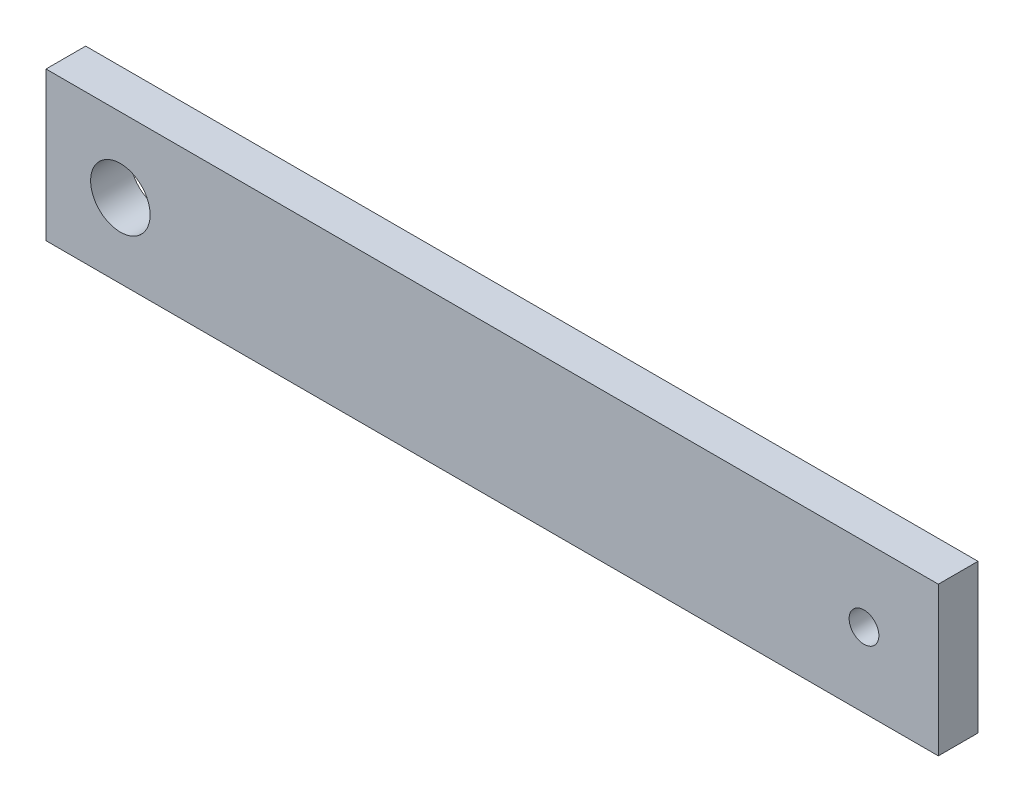
ISO-10303-21;
HEADER;
FILE_DESCRIPTION(('STEP AP214'),'2;1');
FILE_NAME('part.step','',(''),(''),'','','');
FILE_SCHEMA(('AUTOMOTIVE_DESIGN { 1 0 10303 214 1 1 1 1 }'));
ENDSEC;
DATA;
#1=APPLICATION_CONTEXT('core data for automotive mechanical design processes');
#2=APPLICATION_PROTOCOL_DEFINITION('international standard','automotive_design',2000,#1);
#3=PRODUCT_CONTEXT('',#1,'mechanical');
#4=PRODUCT('Part','Part','',(#3));
#5=PRODUCT_RELATED_PRODUCT_CATEGORY('part','',(#4));
#6=PRODUCT_DEFINITION_FORMATION('','',#4);
#7=PRODUCT_DEFINITION_CONTEXT('part definition',#1,'design');
#8=PRODUCT_DEFINITION('design','',#6,#7);
#9=PRODUCT_DEFINITION_SHAPE('','',#8);
#10=(LENGTH_UNIT() NAMED_UNIT(*) SI_UNIT(.MILLI.,.METRE.));
#11=(NAMED_UNIT(*) PLANE_ANGLE_UNIT() SI_UNIT($,.RADIAN.));
#12=(NAMED_UNIT(*) SI_UNIT($,.STERADIAN.) SOLID_ANGLE_UNIT());
#13=UNCERTAINTY_MEASURE_WITH_UNIT(LENGTH_MEASURE(1.E-05),#10,'distance_accuracy_value','');
#14=(GEOMETRIC_REPRESENTATION_CONTEXT(3) GLOBAL_UNCERTAINTY_ASSIGNED_CONTEXT((#13)) GLOBAL_UNIT_ASSIGNED_CONTEXT((#10,
#11,#12)) REPRESENTATION_CONTEXT('',''));
#15=CARTESIAN_POINT('',(0.,0.,0.));
#16=DIRECTION('',(0.,0.,1.));
#17=DIRECTION('',(1.,0.,0.));
#18=AXIS2_PLACEMENT_3D('',#15,#16,#17);
#19=CARTESIAN_POINT('',(0.,0.,8.));
#20=DIRECTION('',(0.,0.,1.));
#21=DIRECTION('',(1.,0.,0.));
#22=AXIS2_PLACEMENT_3D('',#19,#20,#21);
#23=PLANE('',#22);
#24=CARTESIAN_POINT('',(-75.,0.,8.));
#25=DIRECTION('',(0.,0.,1.));
#26=DIRECTION('',(1.,0.,0.));
#27=AXIS2_PLACEMENT_3D('',#24,#25,#26);
#28=CIRCLE('',#27,6.);
#29=CARTESIAN_POINT('',(-69.,0.,8.));
#30=VERTEX_POINT('',#29);
#31=EDGE_CURVE('E103',#30,#30,#28,.T.);
#32=ORIENTED_EDGE('',*,*,#31,.F.);
#33=EDGE_LOOP('',(#32));
#34=FACE_BOUND('',#33,.T.);
#35=DIRECTION('',(0.,1.,0.));
#36=VECTOR('',#35,1.);
#37=CARTESIAN_POINT('',(90.,15.,8.));
#38=LINE('',#37,#36);
#39=CARTESIAN_POINT('',(90.,-15.,8.));
#40=VERTEX_POINT('',#39);
#41=CARTESIAN_POINT('',(90.,15.,8.));
#42=VERTEX_POINT('',#41);
#43=EDGE_CURVE('E88',#40,#42,#38,.T.);
#44=ORIENTED_EDGE('',*,*,#43,.T.);
#45=DIRECTION('',(-1.,0.,0.));
#46=VECTOR('',#45,1.);
#47=CARTESIAN_POINT('',(-90.,15.,8.));
#48=LINE('',#47,#46);
#49=CARTESIAN_POINT('',(-90.,15.,8.));
#50=VERTEX_POINT('',#49);
#51=EDGE_CURVE('E83',#42,#50,#48,.T.);
#52=ORIENTED_EDGE('',*,*,#51,.T.);
#53=DIRECTION('',(0.,-1.,0.));
#54=VECTOR('',#53,1.);
#55=CARTESIAN_POINT('',(-90.,15.,8.));
#56=LINE('',#55,#54);
#57=CARTESIAN_POINT('',(-90.,-15.,8.));
#58=VERTEX_POINT('',#57);
#59=EDGE_CURVE('E86',#50,#58,#56,.T.);
#60=ORIENTED_EDGE('',*,*,#59,.T.);
#61=DIRECTION('',(1.,0.,0.));
#62=VECTOR('',#61,1.);
#63=CARTESIAN_POINT('',(-90.,-15.,8.));
#64=LINE('',#63,#62);
#65=EDGE_CURVE('E53',#58,#40,#64,.T.);
#66=ORIENTED_EDGE('',*,*,#65,.T.);
#67=EDGE_LOOP('',(#44,#52,#60,#66));
#68=FACE_BOUND('',#67,.T.);
#69=CARTESIAN_POINT('',(75.,0.,8.));
#70=DIRECTION('',(0.,0.,1.));
#71=DIRECTION('',(1.,0.,0.));
#72=AXIS2_PLACEMENT_3D('',#69,#70,#71);
#73=CIRCLE('',#72,3.00000000000001);
#74=CARTESIAN_POINT('',(78.,0.,8.));
#75=VERTEX_POINT('',#74);
#76=EDGE_CURVE('E118',#75,#75,#73,.T.);
#77=ORIENTED_EDGE('',*,*,#76,.F.);
#78=EDGE_LOOP('',(#77));
#79=FACE_BOUND('',#78,.T.);
#80=ADVANCED_FACE('F36',(#34,#68,#79),#23,.T.);
#81=CARTESIAN_POINT('',(0.,0.,0.));
#82=DIRECTION('',(0.,0.,1.));
#83=DIRECTION('',(1.,0.,0.));
#84=AXIS2_PLACEMENT_3D('',#81,#82,#83);
#85=PLANE('',#84);
#86=DIRECTION('',(0.,1.,0.));
#87=VECTOR('',#86,1.);
#88=CARTESIAN_POINT('',(90.,15.,0.));
#89=LINE('',#88,#87);
#90=CARTESIAN_POINT('',(90.,-15.,0.));
#91=VERTEX_POINT('',#90);
#92=CARTESIAN_POINT('',(90.,15.,0.));
#93=VERTEX_POINT('',#92);
#94=EDGE_CURVE('E100',#91,#93,#89,.T.);
#95=ORIENTED_EDGE('',*,*,#94,.F.);
#96=DIRECTION('',(1.,0.,0.));
#97=VECTOR('',#96,1.);
#98=CARTESIAN_POINT('',(-90.,-15.,0.));
#99=LINE('',#98,#97);
#100=CARTESIAN_POINT('',(-90.,-15.,0.));
#101=VERTEX_POINT('',#100);
#102=EDGE_CURVE('E76',#101,#91,#99,.T.);
#103=ORIENTED_EDGE('',*,*,#102,.F.);
#104=DIRECTION('',(0.,-1.,0.));
#105=VECTOR('',#104,1.);
#106=CARTESIAN_POINT('',(-90.,15.,0.));
#107=LINE('',#106,#105);
#108=CARTESIAN_POINT('',(-90.,15.,0.));
#109=VERTEX_POINT('',#108);
#110=EDGE_CURVE('E70',#109,#101,#107,.T.);
#111=ORIENTED_EDGE('',*,*,#110,.F.);
#112=DIRECTION('',(-1.,0.,0.));
#113=VECTOR('',#112,1.);
#114=CARTESIAN_POINT('',(-90.,15.,0.));
#115=LINE('',#114,#113);
#116=EDGE_CURVE('E92',#93,#109,#115,.T.);
#117=ORIENTED_EDGE('',*,*,#116,.F.);
#118=EDGE_LOOP('',(#95,#103,#111,#117));
#119=FACE_BOUND('',#118,.T.);
#120=CARTESIAN_POINT('',(-75.,0.,0.));
#121=DIRECTION('',(0.,0.,1.));
#122=DIRECTION('',(1.,0.,0.));
#123=AXIS2_PLACEMENT_3D('',#120,#121,#122);
#124=CIRCLE('',#123,6.);
#125=CARTESIAN_POINT('',(-69.,0.,0.));
#126=VERTEX_POINT('',#125);
#127=EDGE_CURVE('E115',#126,#126,#124,.T.);
#128=ORIENTED_EDGE('',*,*,#127,.T.);
#129=EDGE_LOOP('',(#128));
#130=FACE_BOUND('',#129,.T.);
#131=CARTESIAN_POINT('',(75.,0.,0.));
#132=DIRECTION('',(0.,0.,1.));
#133=DIRECTION('',(1.,0.,0.));
#134=AXIS2_PLACEMENT_3D('',#131,#132,#133);
#135=CIRCLE('',#134,3.00000000000001);
#136=CARTESIAN_POINT('',(78.,0.,0.));
#137=VERTEX_POINT('',#136);
#138=EDGE_CURVE('E121',#137,#137,#135,.T.);
#139=ORIENTED_EDGE('',*,*,#138,.T.);
#140=EDGE_LOOP('',(#139));
#141=FACE_BOUND('',#140,.T.);
#142=ADVANCED_FACE('F111',(#119,#130,#141),#85,.F.);
#143=CARTESIAN_POINT('',(90.,15.,8.));
#144=DIRECTION('',(-1.,0.,0.));
#145=DIRECTION('',(0.,0.,1.));
#146=AXIS2_PLACEMENT_3D('',#143,#144,#145);
#147=PLANE('',#146);
#148=ORIENTED_EDGE('',*,*,#94,.T.);
#149=DIRECTION('',(0.,0.,-1.));
#150=VECTOR('',#149,1.);
#151=CARTESIAN_POINT('',(90.,15.,8.));
#152=LINE('',#151,#150);
#153=EDGE_CURVE('E11',#42,#93,#152,.T.);
#154=ORIENTED_EDGE('',*,*,#153,.F.);
#155=ORIENTED_EDGE('',*,*,#43,.F.);
#156=DIRECTION('',(0.,0.,-1.));
#157=VECTOR('',#156,1.);
#158=CARTESIAN_POINT('',(90.,-15.,8.));
#159=LINE('',#158,#157);
#160=EDGE_CURVE('E96',#40,#91,#159,.T.);
#161=ORIENTED_EDGE('',*,*,#160,.T.);
#162=EDGE_LOOP('',(#148,#154,#155,#161));
#163=FACE_BOUND('',#162,.T.);
#164=ADVANCED_FACE('F38',(#163),#147,.F.);
#165=CARTESIAN_POINT('',(-90.,15.,8.));
#166=DIRECTION('',(0.,-1.,0.));
#167=DIRECTION('',(0.,0.,-1.));
#168=AXIS2_PLACEMENT_3D('',#165,#166,#167);
#169=PLANE('',#168);
#170=ORIENTED_EDGE('',*,*,#116,.T.);
#171=DIRECTION('',(0.,0.,-1.));
#172=VECTOR('',#171,1.);
#173=CARTESIAN_POINT('',(-90.,15.,8.));
#174=LINE('',#173,#172);
#175=EDGE_CURVE('E45',#50,#109,#174,.T.);
#176=ORIENTED_EDGE('',*,*,#175,.F.);
#177=ORIENTED_EDGE('',*,*,#51,.F.);
#178=ORIENTED_EDGE('',*,*,#153,.T.);
#179=EDGE_LOOP('',(#170,#176,#177,#178));
#180=FACE_BOUND('',#179,.T.);
#181=ADVANCED_FACE('F91',(#180),#169,.F.);
#182=CARTESIAN_POINT('',(-90.,15.,8.));
#183=DIRECTION('',(1.,0.,0.));
#184=DIRECTION('',(0.,0.,-1.));
#185=AXIS2_PLACEMENT_3D('',#182,#183,#184);
#186=PLANE('',#185);
#187=ORIENTED_EDGE('',*,*,#110,.T.);
#188=DIRECTION('',(0.,0.,-1.));
#189=VECTOR('',#188,1.);
#190=CARTESIAN_POINT('',(-90.,-15.,8.));
#191=LINE('',#190,#189);
#192=EDGE_CURVE('E93',#58,#101,#191,.T.);
#193=ORIENTED_EDGE('',*,*,#192,.F.);
#194=ORIENTED_EDGE('',*,*,#59,.F.);
#195=ORIENTED_EDGE('',*,*,#175,.T.);
#196=EDGE_LOOP('',(#187,#193,#194,#195));
#197=FACE_BOUND('',#196,.T.);
#198=ADVANCED_FACE('F94',(#197),#186,.F.);
#199=CARTESIAN_POINT('',(-90.,-15.,8.));
#200=DIRECTION('',(0.,1.,0.));
#201=DIRECTION('',(0.,0.,1.));
#202=AXIS2_PLACEMENT_3D('',#199,#200,#201);
#203=PLANE('',#202);
#204=ORIENTED_EDGE('',*,*,#102,.T.);
#205=ORIENTED_EDGE('',*,*,#160,.F.);
#206=ORIENTED_EDGE('',*,*,#65,.F.);
#207=ORIENTED_EDGE('',*,*,#192,.T.);
#208=EDGE_LOOP('',(#204,#205,#206,#207));
#209=FACE_BOUND('',#208,.T.);
#210=ADVANCED_FACE('F108',(#209),#203,.F.);
#211=CARTESIAN_POINT('',(-75.,0.,8.));
#212=DIRECTION('',(0.,0.,-1.));
#213=DIRECTION('',(-1.,0.,0.));
#214=AXIS2_PLACEMENT_3D('',#211,#212,#213);
#215=CYLINDRICAL_SURFACE('',#214,6.);
#216=ORIENTED_EDGE('',*,*,#31,.T.);
#217=EDGE_LOOP('',(#216));
#218=FACE_BOUND('',#217,.T.);
#219=ORIENTED_EDGE('',*,*,#127,.F.);
#220=EDGE_LOOP('',(#219));
#221=FACE_BOUND('',#220,.T.);
#222=ADVANCED_FACE('F138',(#218,#221),#215,.F.);
#223=CARTESIAN_POINT('',(75.,0.,8.));
#224=DIRECTION('',(0.,0.,-1.));
#225=DIRECTION('',(-1.,0.,0.));
#226=AXIS2_PLACEMENT_3D('',#223,#224,#225);
#227=CYLINDRICAL_SURFACE('',#226,3.00000000000001);
#228=ORIENTED_EDGE('',*,*,#76,.T.);
#229=EDGE_LOOP('',(#228));
#230=FACE_BOUND('',#229,.T.);
#231=ORIENTED_EDGE('',*,*,#138,.F.);
#232=EDGE_LOOP('',(#231));
#233=FACE_BOUND('',#232,.T.);
#234=ADVANCED_FACE('F127',(#230,#233),#227,.F.);
#235=CLOSED_SHELL('',(#80,#142,#164,#181,#198,#210,#222,#234));
#236=MANIFOLD_SOLID_BREP('B2',#235);
#237=ADVANCED_BREP_SHAPE_REPRESENTATION('',(#18,#236),#14);
#238=SHAPE_DEFINITION_REPRESENTATION(#9,#237);
ENDSEC;
END-ISO-10303-21;
